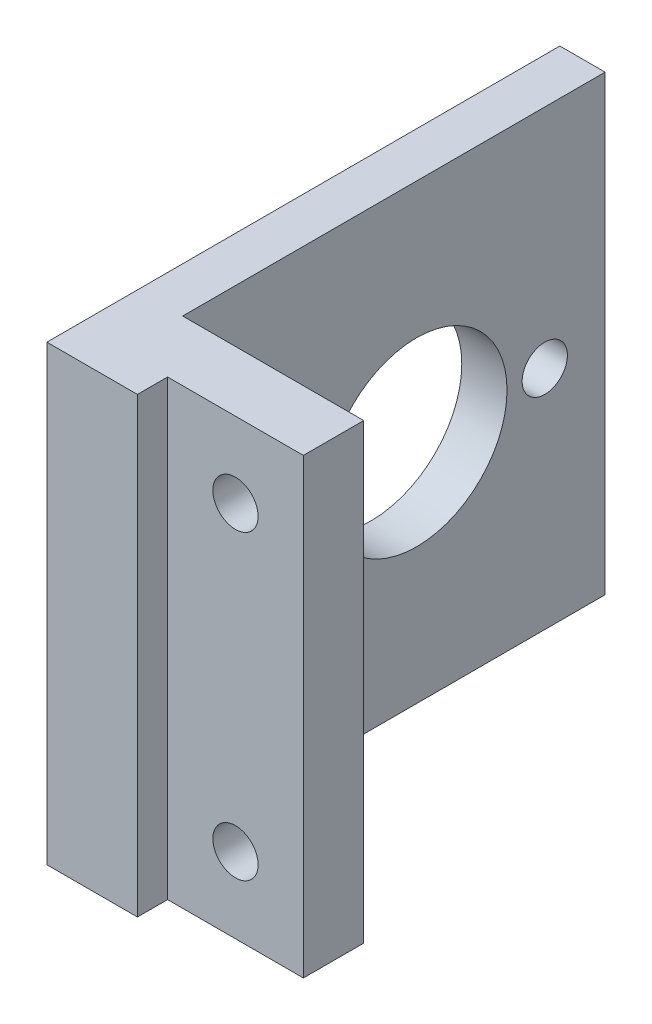
ISO-10303-21;
HEADER;
FILE_DESCRIPTION(('STEP AP214'),'2;1');
FILE_NAME('part.step','',(''),(''),'','','');
FILE_SCHEMA(('AUTOMOTIVE_DESIGN { 1 0 10303 214 1 1 1 1 }'));
ENDSEC;
DATA;
#1=APPLICATION_CONTEXT('core data for automotive mechanical design processes');
#2=APPLICATION_PROTOCOL_DEFINITION('international standard','automotive_design',2000,#1);
#3=PRODUCT_CONTEXT('',#1,'mechanical');
#4=PRODUCT('Part','Part','',(#3));
#5=PRODUCT_RELATED_PRODUCT_CATEGORY('part','',(#4));
#6=PRODUCT_DEFINITION_FORMATION('','',#4);
#7=PRODUCT_DEFINITION_CONTEXT('part definition',#1,'design');
#8=PRODUCT_DEFINITION('design','',#6,#7);
#9=PRODUCT_DEFINITION_SHAPE('','',#8);
#10=(LENGTH_UNIT() NAMED_UNIT(*) SI_UNIT(.MILLI.,.METRE.));
#11=(NAMED_UNIT(*) PLANE_ANGLE_UNIT() SI_UNIT($,.RADIAN.));
#12=(NAMED_UNIT(*) SI_UNIT($,.STERADIAN.) SOLID_ANGLE_UNIT());
#13=UNCERTAINTY_MEASURE_WITH_UNIT(LENGTH_MEASURE(1.E-05),#10,'distance_accuracy_value','');
#14=(GEOMETRIC_REPRESENTATION_CONTEXT(3) GLOBAL_UNCERTAINTY_ASSIGNED_CONTEXT((#13)) GLOBAL_UNIT_ASSIGNED_CONTEXT((#10,
#11,#12)) REPRESENTATION_CONTEXT('',''));
#15=CARTESIAN_POINT('',(0.,0.,0.));
#16=DIRECTION('',(0.,0.,1.));
#17=DIRECTION('',(1.,0.,0.));
#18=AXIS2_PLACEMENT_3D('',#15,#16,#17);
#19=CARTESIAN_POINT('',(0.,30.,0.));
#20=DIRECTION('',(0.,0.,-1.));
#21=DIRECTION('',(-1.,0.,0.));
#22=AXIS2_PLACEMENT_3D('',#19,#20,#21);
#23=PLANE('',#22);
#24=CARTESIAN_POINT('',(10.5,25.,0.));
#25=DIRECTION('',(0.,0.,1.));
#26=DIRECTION('',(1.,0.,0.));
#27=AXIS2_PLACEMENT_3D('',#24,#25,#26);
#28=CIRCLE('',#27,1.5);
#29=CARTESIAN_POINT('',(12.,25.,0.));
#30=VERTEX_POINT('',#29);
#31=EDGE_CURVE('E162',#30,#30,#28,.T.);
#32=ORIENTED_EDGE('',*,*,#31,.F.);
#33=EDGE_LOOP('',(#32));
#34=FACE_BOUND('',#33,.T.);
#35=CARTESIAN_POINT('',(10.5,5.,0.));
#36=DIRECTION('',(0.,0.,1.));
#37=DIRECTION('',(1.,0.,0.));
#38=AXIS2_PLACEMENT_3D('',#35,#36,#37);
#39=CIRCLE('',#38,1.5);
#40=CARTESIAN_POINT('',(12.,5.,0.));
#41=VERTEX_POINT('',#40);
#42=EDGE_CURVE('E170',#41,#41,#39,.T.);
#43=ORIENTED_EDGE('',*,*,#42,.F.);
#44=EDGE_LOOP('',(#43));
#45=FACE_BOUND('',#44,.T.);
#46=DIRECTION('',(0.,1.,0.));
#47=VECTOR('',#46,1.);
#48=CARTESIAN_POINT('',(6.,30.,0.));
#49=LINE('',#48,#47);
#50=CARTESIAN_POINT('',(6.,0.,0.));
#51=VERTEX_POINT('',#50);
#52=CARTESIAN_POINT('',(6.,30.,0.));
#53=VERTEX_POINT('',#52);
#54=EDGE_CURVE('E57',#51,#53,#49,.T.);
#55=ORIENTED_EDGE('',*,*,#54,.F.);
#56=DIRECTION('',(1.,0.,0.));
#57=VECTOR('',#56,1.);
#58=CARTESIAN_POINT('',(0.,0.,0.));
#59=LINE('',#58,#57);
#60=CARTESIAN_POINT('',(15.,0.,0.));
#61=VERTEX_POINT('',#60);
#62=EDGE_CURVE('E139',#51,#61,#59,.T.);
#63=ORIENTED_EDGE('',*,*,#62,.T.);
#64=DIRECTION('',(0.,-1.,0.));
#65=VECTOR('',#64,1.);
#66=CARTESIAN_POINT('',(15.,30.,0.));
#67=LINE('',#66,#65);
#68=CARTESIAN_POINT('',(15.,30.,0.));
#69=VERTEX_POINT('',#68);
#70=EDGE_CURVE('E11',#69,#61,#67,.T.);
#71=ORIENTED_EDGE('',*,*,#70,.F.);
#72=DIRECTION('',(1.,0.,0.));
#73=VECTOR('',#72,1.);
#74=CARTESIAN_POINT('',(0.,30.,0.));
#75=LINE('',#74,#73);
#76=EDGE_CURVE('E96',#53,#69,#75,.T.);
#77=ORIENTED_EDGE('',*,*,#76,.F.);
#78=EDGE_LOOP('',(#55,#63,#71,#77));
#79=FACE_BOUND('',#78,.T.);
#80=ADVANCED_FACE('F39',(#34,#45,#79),#23,.F.);
#81=CARTESIAN_POINT('',(0.,30.,0.));
#82=DIRECTION('',(1.,0.,0.));
#83=DIRECTION('',(0.,0.,-1.));
#84=AXIS2_PLACEMENT_3D('',#81,#82,#83);
#85=PLANE('',#84);
#86=CARTESIAN_POINT('',(0.,15.,-28.));
#87=DIRECTION('',(1.,0.,0.));
#88=DIRECTION('',(0.,0.,-1.));
#89=AXIS2_PLACEMENT_3D('',#86,#87,#88);
#90=CIRCLE('',#89,1.5);
#91=CARTESIAN_POINT('',(0.,15.,-29.5));
#92=VERTEX_POINT('',#91);
#93=EDGE_CURVE('E178',#92,#92,#90,.T.);
#94=ORIENTED_EDGE('',*,*,#93,.T.);
#95=EDGE_LOOP('',(#94));
#96=FACE_BOUND('',#95,.T.);
#97=CARTESIAN_POINT('',(0.,15.,-11.));
#98=DIRECTION('',(1.,0.,0.));
#99=DIRECTION('',(0.,0.,-1.));
#100=AXIS2_PLACEMENT_3D('',#97,#98,#99);
#101=CIRCLE('',#100,1.5);
#102=CARTESIAN_POINT('',(0.,15.,-12.5));
#103=VERTEX_POINT('',#102);
#104=EDGE_CURVE('E186',#103,#103,#101,.T.);
#105=ORIENTED_EDGE('',*,*,#104,.T.);
#106=EDGE_LOOP('',(#105));
#107=FACE_BOUND('',#106,.T.);
#108=CARTESIAN_POINT('',(0.,15.,-19.5));
#109=DIRECTION('',(1.,0.,0.));
#110=DIRECTION('',(0.,0.,-1.));
#111=AXIS2_PLACEMENT_3D('',#108,#109,#110);
#112=CIRCLE('',#111,6.);
#113=CARTESIAN_POINT('',(0.,15.,-25.5));
#114=VERTEX_POINT('',#113);
#115=EDGE_CURVE('E140',#114,#114,#112,.T.);
#116=ORIENTED_EDGE('',*,*,#115,.T.);
#117=EDGE_LOOP('',(#116));
#118=FACE_BOUND('',#117,.T.);
#119=DIRECTION('',(0.,0.,1.));
#120=VECTOR('',#119,1.);
#121=CARTESIAN_POINT('',(0.,0.,0.));
#122=LINE('',#121,#120);
#123=CARTESIAN_POINT('',(0.,0.,-32.));
#124=VERTEX_POINT('',#123);
#125=CARTESIAN_POINT('',(0.,0.,2.));
#126=VERTEX_POINT('',#125);
#127=EDGE_CURVE('E135',#124,#126,#122,.T.);
#128=ORIENTED_EDGE('',*,*,#127,.T.);
#129=DIRECTION('',(0.,-1.,0.));
#130=VECTOR('',#129,1.);
#131=CARTESIAN_POINT('',(0.,30.,2.));
#132=LINE('',#131,#130);
#133=CARTESIAN_POINT('',(0.,30.,2.));
#134=VERTEX_POINT('',#133);
#135=EDGE_CURVE('E193',#134,#126,#132,.T.);
#136=ORIENTED_EDGE('',*,*,#135,.F.);
#137=DIRECTION('',(0.,0.,1.));
#138=VECTOR('',#137,1.);
#139=CARTESIAN_POINT('',(0.,30.,0.));
#140=LINE('',#139,#138);
#141=CARTESIAN_POINT('',(0.,30.,-32.));
#142=VERTEX_POINT('',#141);
#143=EDGE_CURVE('E153',#142,#134,#140,.T.);
#144=ORIENTED_EDGE('',*,*,#143,.F.);
#145=DIRECTION('',(0.,-1.,0.));
#146=VECTOR('',#145,1.);
#147=CARTESIAN_POINT('',(0.,30.,-32.));
#148=LINE('',#147,#146);
#149=EDGE_CURVE('E131',#142,#124,#148,.T.);
#150=ORIENTED_EDGE('',*,*,#149,.T.);
#151=EDGE_LOOP('',(#128,#136,#144,#150));
#152=FACE_BOUND('',#151,.T.);
#153=ADVANCED_FACE('F41',(#96,#107,#118,#152),#85,.F.);
#154=CARTESIAN_POINT('',(15.,30.,0.));
#155=DIRECTION('',(-1.,0.,0.));
#156=DIRECTION('',(0.,0.,1.));
#157=AXIS2_PLACEMENT_3D('',#154,#155,#156);
#158=PLANE('',#157);
#159=DIRECTION('',(0.,0.,-1.));
#160=VECTOR('',#159,1.);
#161=CARTESIAN_POINT('',(15.,0.,0.));
#162=LINE('',#161,#160);
#163=CARTESIAN_POINT('',(15.,0.,-4.));
#164=VERTEX_POINT('',#163);
#165=EDGE_CURVE('E143',#61,#164,#162,.T.);
#166=ORIENTED_EDGE('',*,*,#165,.T.);
#167=DIRECTION('',(0.,-1.,0.));
#168=VECTOR('',#167,1.);
#169=CARTESIAN_POINT('',(15.,30.,-4.));
#170=LINE('',#169,#168);
#171=CARTESIAN_POINT('',(15.,30.,-4.));
#172=VERTEX_POINT('',#171);
#173=EDGE_CURVE('E49',#172,#164,#170,.T.);
#174=ORIENTED_EDGE('',*,*,#173,.F.);
#175=DIRECTION('',(0.,0.,-1.));
#176=VECTOR('',#175,1.);
#177=CARTESIAN_POINT('',(15.,30.,0.));
#178=LINE('',#177,#176);
#179=EDGE_CURVE('E111',#69,#172,#178,.T.);
#180=ORIENTED_EDGE('',*,*,#179,.F.);
#181=ORIENTED_EDGE('',*,*,#70,.T.);
#182=EDGE_LOOP('',(#166,#174,#180,#181));
#183=FACE_BOUND('',#182,.T.);
#184=ADVANCED_FACE('F252',(#183),#158,.F.);
#185=CARTESIAN_POINT('',(15.,30.,-4.));
#186=DIRECTION('',(0.,0.,1.));
#187=DIRECTION('',(1.,0.,0.));
#188=AXIS2_PLACEMENT_3D('',#185,#186,#187);
#189=PLANE('',#188);
#190=CARTESIAN_POINT('',(10.5,25.,-4.));
#191=DIRECTION('',(0.,0.,1.));
#192=DIRECTION('',(1.,0.,0.));
#193=AXIS2_PLACEMENT_3D('',#190,#191,#192);
#194=CIRCLE('',#193,1.5);
#195=CARTESIAN_POINT('',(12.,25.,-4.));
#196=VERTEX_POINT('',#195);
#197=EDGE_CURVE('E43',#196,#196,#194,.T.);
#198=ORIENTED_EDGE('',*,*,#197,.T.);
#199=EDGE_LOOP('',(#198));
#200=FACE_BOUND('',#199,.T.);
#201=CARTESIAN_POINT('',(10.5,5.,-4.));
#202=DIRECTION('',(0.,0.,1.));
#203=DIRECTION('',(1.,0.,0.));
#204=AXIS2_PLACEMENT_3D('',#201,#202,#203);
#205=CIRCLE('',#204,1.5);
#206=CARTESIAN_POINT('',(12.,5.,-4.));
#207=VERTEX_POINT('',#206);
#208=EDGE_CURVE('E159',#207,#207,#205,.T.);
#209=ORIENTED_EDGE('',*,*,#208,.T.);
#210=EDGE_LOOP('',(#209));
#211=FACE_BOUND('',#210,.T.);
#212=DIRECTION('',(-1.,0.,0.));
#213=VECTOR('',#212,1.);
#214=CARTESIAN_POINT('',(15.,0.,-4.));
#215=LINE('',#214,#213);
#216=CARTESIAN_POINT('',(3.,0.,-4.));
#217=VERTEX_POINT('',#216);
#218=EDGE_CURVE('E121',#164,#217,#215,.T.);
#219=ORIENTED_EDGE('',*,*,#218,.T.);
#220=DIRECTION('',(0.,-1.,0.));
#221=VECTOR('',#220,1.);
#222=CARTESIAN_POINT('',(3.,30.,-4.));
#223=LINE('',#222,#221);
#224=CARTESIAN_POINT('',(3.,30.,-4.));
#225=VERTEX_POINT('',#224);
#226=EDGE_CURVE('E118',#225,#217,#223,.T.);
#227=ORIENTED_EDGE('',*,*,#226,.F.);
#228=DIRECTION('',(-1.,0.,0.));
#229=VECTOR('',#228,1.);
#230=CARTESIAN_POINT('',(15.,30.,-4.));
#231=LINE('',#230,#229);
#232=EDGE_CURVE('E104',#172,#225,#231,.T.);
#233=ORIENTED_EDGE('',*,*,#232,.F.);
#234=ORIENTED_EDGE('',*,*,#173,.T.);
#235=EDGE_LOOP('',(#219,#227,#233,#234));
#236=FACE_BOUND('',#235,.T.);
#237=ADVANCED_FACE('F119',(#200,#211,#236),#189,.F.);
#238=CARTESIAN_POINT('',(3.,30.,-32.));
#239=DIRECTION('',(-1.,0.,0.));
#240=DIRECTION('',(0.,0.,1.));
#241=AXIS2_PLACEMENT_3D('',#238,#239,#240);
#242=PLANE('',#241);
#243=CARTESIAN_POINT('',(3.,15.,-28.));
#244=DIRECTION('',(1.,0.,0.));
#245=DIRECTION('',(0.,0.,-1.));
#246=AXIS2_PLACEMENT_3D('',#243,#244,#245);
#247=CIRCLE('',#246,1.5);
#248=CARTESIAN_POINT('',(3.,15.,-29.5));
#249=VERTEX_POINT('',#248);
#250=EDGE_CURVE('E182',#249,#249,#247,.T.);
#251=ORIENTED_EDGE('',*,*,#250,.F.);
#252=EDGE_LOOP('',(#251));
#253=FACE_BOUND('',#252,.T.);
#254=CARTESIAN_POINT('',(3.,15.,-11.));
#255=DIRECTION('',(1.,0.,0.));
#256=DIRECTION('',(0.,0.,-1.));
#257=AXIS2_PLACEMENT_3D('',#254,#255,#256);
#258=CIRCLE('',#257,1.5);
#259=CARTESIAN_POINT('',(3.,15.,-12.5));
#260=VERTEX_POINT('',#259);
#261=EDGE_CURVE('E168',#260,#260,#258,.T.);
#262=ORIENTED_EDGE('',*,*,#261,.F.);
#263=EDGE_LOOP('',(#262));
#264=FACE_BOUND('',#263,.T.);
#265=CARTESIAN_POINT('',(3.,15.,-19.5));
#266=DIRECTION('',(1.,0.,0.));
#267=DIRECTION('',(0.,0.,-1.));
#268=AXIS2_PLACEMENT_3D('',#265,#266,#267);
#269=CIRCLE('',#268,6.);
#270=CARTESIAN_POINT('',(3.,15.,-25.5));
#271=VERTEX_POINT('',#270);
#272=EDGE_CURVE('E218',#271,#271,#269,.T.);
#273=ORIENTED_EDGE('',*,*,#272,.F.);
#274=EDGE_LOOP('',(#273));
#275=FACE_BOUND('',#274,.T.);
#276=DIRECTION('',(0.,0.,-1.));
#277=VECTOR('',#276,1.);
#278=CARTESIAN_POINT('',(3.,0.,-32.));
#279=LINE('',#278,#277);
#280=CARTESIAN_POINT('',(3.,0.,-32.));
#281=VERTEX_POINT('',#280);
#282=EDGE_CURVE('E148',#217,#281,#279,.T.);
#283=ORIENTED_EDGE('',*,*,#282,.T.);
#284=DIRECTION('',(0.,-1.,0.));
#285=VECTOR('',#284,1.);
#286=CARTESIAN_POINT('',(3.,30.,-32.));
#287=LINE('',#286,#285);
#288=CARTESIAN_POINT('',(3.,30.,-32.));
#289=VERTEX_POINT('',#288);
#290=EDGE_CURVE('E125',#289,#281,#287,.T.);
#291=ORIENTED_EDGE('',*,*,#290,.F.);
#292=DIRECTION('',(0.,0.,-1.));
#293=VECTOR('',#292,1.);
#294=CARTESIAN_POINT('',(3.,30.,-32.));
#295=LINE('',#294,#293);
#296=EDGE_CURVE('E108',#225,#289,#295,.T.);
#297=ORIENTED_EDGE('',*,*,#296,.F.);
#298=ORIENTED_EDGE('',*,*,#226,.T.);
#299=EDGE_LOOP('',(#283,#291,#297,#298));
#300=FACE_BOUND('',#299,.T.);
#301=ADVANCED_FACE('F127',(#253,#264,#275,#300),#242,.F.);
#302=CARTESIAN_POINT('',(0.,30.,-32.));
#303=DIRECTION('',(0.,0.,1.));
#304=DIRECTION('',(1.,0.,0.));
#305=AXIS2_PLACEMENT_3D('',#302,#303,#304);
#306=PLANE('',#305);
#307=DIRECTION('',(-1.,0.,0.));
#308=VECTOR('',#307,1.);
#309=CARTESIAN_POINT('',(0.,0.,-32.));
#310=LINE('',#309,#308);
#311=EDGE_CURVE('E89',#281,#124,#310,.T.);
#312=ORIENTED_EDGE('',*,*,#311,.T.);
#313=ORIENTED_EDGE('',*,*,#149,.F.);
#314=DIRECTION('',(-1.,0.,0.));
#315=VECTOR('',#314,1.);
#316=CARTESIAN_POINT('',(0.,30.,-32.));
#317=LINE('',#316,#315);
#318=EDGE_CURVE('E66',#289,#142,#317,.T.);
#319=ORIENTED_EDGE('',*,*,#318,.F.);
#320=ORIENTED_EDGE('',*,*,#290,.T.);
#321=EDGE_LOOP('',(#312,#313,#319,#320));
#322=FACE_BOUND('',#321,.T.);
#323=ADVANCED_FACE('F253',(#322),#306,.F.);
#324=CARTESIAN_POINT('',(0.,30.,0.));
#325=DIRECTION('',(0.,-1.,0.));
#326=DIRECTION('',(0.,0.,-1.));
#327=AXIS2_PLACEMENT_3D('',#324,#325,#326);
#328=PLANE('',#327);
#329=ORIENTED_EDGE('',*,*,#143,.T.);
#330=DIRECTION('',(-1.,0.,0.));
#331=VECTOR('',#330,1.);
#332=CARTESIAN_POINT('',(0.,30.,2.));
#333=LINE('',#332,#331);
#334=CARTESIAN_POINT('',(6.,30.,2.));
#335=VERTEX_POINT('',#334);
#336=EDGE_CURVE('E205',#335,#134,#333,.T.);
#337=ORIENTED_EDGE('',*,*,#336,.F.);
#338=DIRECTION('',(0.,0.,-1.));
#339=VECTOR('',#338,1.);
#340=CARTESIAN_POINT('',(6.,30.,2.));
#341=LINE('',#340,#339);
#342=EDGE_CURVE('E209',#335,#53,#341,.T.);
#343=ORIENTED_EDGE('',*,*,#342,.T.);
#344=ORIENTED_EDGE('',*,*,#76,.T.);
#345=ORIENTED_EDGE('',*,*,#179,.T.);
#346=ORIENTED_EDGE('',*,*,#232,.T.);
#347=ORIENTED_EDGE('',*,*,#296,.T.);
#348=ORIENTED_EDGE('',*,*,#318,.T.);
#349=EDGE_LOOP('',(#329,#337,#343,#344,#345,#346,#347,#348));
#350=FACE_BOUND('',#349,.T.);
#351=ADVANCED_FACE('F106',(#350),#328,.F.);
#352=CARTESIAN_POINT('',(0.,0.,0.));
#353=DIRECTION('',(0.,-1.,0.));
#354=DIRECTION('',(0.,0.,-1.));
#355=AXIS2_PLACEMENT_3D('',#352,#353,#354);
#356=PLANE('',#355);
#357=ORIENTED_EDGE('',*,*,#127,.F.);
#358=ORIENTED_EDGE('',*,*,#311,.F.);
#359=ORIENTED_EDGE('',*,*,#282,.F.);
#360=ORIENTED_EDGE('',*,*,#218,.F.);
#361=ORIENTED_EDGE('',*,*,#165,.F.);
#362=ORIENTED_EDGE('',*,*,#62,.F.);
#363=DIRECTION('',(0.,0.,-1.));
#364=VECTOR('',#363,1.);
#365=CARTESIAN_POINT('',(6.,0.,2.));
#366=LINE('',#365,#364);
#367=CARTESIAN_POINT('',(6.,0.,2.));
#368=VERTEX_POINT('',#367);
#369=EDGE_CURVE('E214',#368,#51,#366,.T.);
#370=ORIENTED_EDGE('',*,*,#369,.F.);
#371=DIRECTION('',(1.,0.,0.));
#372=VECTOR('',#371,1.);
#373=CARTESIAN_POINT('',(0.,0.,2.));
#374=LINE('',#373,#372);
#375=EDGE_CURVE('E197',#126,#368,#374,.T.);
#376=ORIENTED_EDGE('',*,*,#375,.F.);
#377=EDGE_LOOP('',(#357,#358,#359,#360,#361,#362,#370,#376));
#378=FACE_BOUND('',#377,.T.);
#379=ADVANCED_FACE('F245',(#378),#356,.T.);
#380=CARTESIAN_POINT('',(-23.,15.,-19.5));
#381=DIRECTION('',(1.,0.,0.));
#382=DIRECTION('',(0.,0.,-1.));
#383=AXIS2_PLACEMENT_3D('',#380,#381,#382);
#384=CYLINDRICAL_SURFACE('',#383,6.);
#385=CARTESIAN_POINT('',(3.,15.,-25.5));
#386=CARTESIAN_POINT('',(2.96875,15.,-25.5));
#387=CARTESIAN_POINT('',(2.9375,15.,-25.5));
#388=CARTESIAN_POINT('',(2.875,15.,-25.5));
#389=CARTESIAN_POINT('',(2.84375,15.,-25.5));
#390=CARTESIAN_POINT('',(2.78125,15.,-25.5));
#391=CARTESIAN_POINT('',(2.75,15.,-25.5));
#392=CARTESIAN_POINT('',(2.6875,15.,-25.5));
#393=CARTESIAN_POINT('',(2.65625,15.,-25.5));
#394=CARTESIAN_POINT('',(2.59375,15.,-25.5));
#395=CARTESIAN_POINT('',(2.5625,15.,-25.5));
#396=CARTESIAN_POINT('',(2.5,15.,-25.5));
#397=CARTESIAN_POINT('',(2.46875,15.,-25.5));
#398=CARTESIAN_POINT('',(2.40625,15.,-25.5));
#399=CARTESIAN_POINT('',(2.375,15.,-25.5));
#400=CARTESIAN_POINT('',(2.3125,15.,-25.5));
#401=CARTESIAN_POINT('',(2.28125,15.,-25.5));
#402=CARTESIAN_POINT('',(2.21875,15.,-25.5));
#403=CARTESIAN_POINT('',(2.1875,15.,-25.5));
#404=CARTESIAN_POINT('',(2.125,15.,-25.5));
#405=CARTESIAN_POINT('',(2.09375,15.,-25.5));
#406=CARTESIAN_POINT('',(2.03125,15.,-25.5));
#407=CARTESIAN_POINT('',(2.,15.,-25.5));
#408=CARTESIAN_POINT('',(1.9375,15.,-25.5));
#409=CARTESIAN_POINT('',(1.90625,15.,-25.5));
#410=CARTESIAN_POINT('',(1.84375,15.,-25.5));
#411=CARTESIAN_POINT('',(1.8125,15.,-25.5));
#412=CARTESIAN_POINT('',(1.75,15.,-25.5));
#413=CARTESIAN_POINT('',(1.71875,15.,-25.5));
#414=CARTESIAN_POINT('',(1.65625,15.,-25.5));
#415=CARTESIAN_POINT('',(1.625,15.,-25.5));
#416=CARTESIAN_POINT('',(1.5625,15.,-25.5));
#417=CARTESIAN_POINT('',(1.53125,15.,-25.5));
#418=CARTESIAN_POINT('',(1.46875,15.,-25.5));
#419=CARTESIAN_POINT('',(1.4375,15.,-25.5));
#420=CARTESIAN_POINT('',(1.375,15.,-25.5));
#421=CARTESIAN_POINT('',(1.34375,15.,-25.5));
#422=CARTESIAN_POINT('',(1.28125,15.,-25.5));
#423=CARTESIAN_POINT('',(1.25,15.,-25.5));
#424=CARTESIAN_POINT('',(1.1875,15.,-25.5));
#425=CARTESIAN_POINT('',(1.15625,15.,-25.5));
#426=CARTESIAN_POINT('',(1.09375,15.,-25.5));
#427=CARTESIAN_POINT('',(1.0625,15.,-25.5));
#428=CARTESIAN_POINT('',(0.999999999999997,15.,-25.5));
#429=CARTESIAN_POINT('',(0.968749999999997,15.,-25.5));
#430=CARTESIAN_POINT('',(0.906249999999997,15.,-25.5));
#431=CARTESIAN_POINT('',(0.874999999999997,15.,-25.5));
#432=CARTESIAN_POINT('',(0.812499999999998,15.,-25.5));
#433=CARTESIAN_POINT('',(0.78125,15.,-25.5));
#434=CARTESIAN_POINT('',(0.718749999999999,15.,-25.5));
#435=CARTESIAN_POINT('',(0.687499999999998,15.,-25.5));
#436=CARTESIAN_POINT('',(0.624999999999998,15.,-25.5));
#437=CARTESIAN_POINT('',(0.593749999999999,15.,-25.5));
#438=CARTESIAN_POINT('',(0.53125,15.,-25.5));
#439=CARTESIAN_POINT('',(0.5,15.,-25.5));
#440=CARTESIAN_POINT('',(0.4375,15.,-25.5));
#441=CARTESIAN_POINT('',(0.40625,15.,-25.5));
#442=CARTESIAN_POINT('',(0.34375,15.,-25.5));
#443=CARTESIAN_POINT('',(0.3125,15.,-25.5));
#444=CARTESIAN_POINT('',(0.25,15.,-25.5));
#445=CARTESIAN_POINT('',(0.21875,15.,-25.5));
#446=CARTESIAN_POINT('',(0.15625,15.,-25.5));
#447=CARTESIAN_POINT('',(0.125,15.,-25.5));
#448=CARTESIAN_POINT('',(0.0625000000000001,15.,-25.5));
#449=CARTESIAN_POINT('',(0.03125,15.,-25.5));
#450=CARTESIAN_POINT('',(0.,15.,-25.5));
#451=B_SPLINE_CURVE_WITH_KNOTS('',3,(#385,#386,#387,#388,#389,#390,#391,#392,#393,#394,#395,
#396,#397,#398,#399,#400,#401,#402,#403,#404,#405,#406,#407,#408,#409,#410,#411,#412,#413,#414,
#415,#416,#417,#418,#419,#420,#421,#422,#423,#424,#425,#426,#427,#428,#429,#430,#431,#432,#433,
#434,#435,#436,#437,#438,#439,#440,#441,#442,#443,#444,#445,#446,#447,#448,#449,#450),
.UNSPECIFIED.,.F.,.F.,(4,2,2,2,2,2,2,2,2,2,2,2,2,2,2,2,2,2,2,2,2,2,2,2,2,2,2,2,2,2,2,2,4),(0.,
0.0937500000000001,0.1875,0.28125,0.375,0.46875,0.5625,0.656250000000001,0.750000000000001,
0.843749999999997,0.937499999999997,1.03125,1.125,1.21875,1.3125,1.40625,1.5,1.59375,1.6875,
1.78125,1.875,1.96875,2.0625,2.15625,2.25,2.34375,2.4375,2.53125,2.625,2.71875,2.8125,2.90625,
3.),.UNSPECIFIED.);
#452=EDGE_CURVE('BSEAM302',#271,#114,#451,.T.);
#453=ORIENTED_EDGE('',*,*,#272,.T.);
#454=ORIENTED_EDGE('',*,*,#115,.F.);
#455=ORIENTED_EDGE('',*,*,#452,.T.);
#456=ORIENTED_EDGE('',*,*,#452,.F.);
#457=EDGE_LOOP('',(#453,#455,#454,#456));
#458=FACE_BOUND('',#457,.T.);
#459=ADVANCED_FACE('F302',(#458),#384,.F.);
#460=CARTESIAN_POINT('',(6.,30.,2.));
#461=DIRECTION('',(-1.,0.,0.));
#462=DIRECTION('',(0.,-1.,0.));
#463=AXIS2_PLACEMENT_3D('',#460,#461,#462);
#464=PLANE('',#463);
#465=ORIENTED_EDGE('',*,*,#54,.T.);
#466=ORIENTED_EDGE('',*,*,#342,.F.);
#467=DIRECTION('',(0.,1.,0.));
#468=VECTOR('',#467,1.);
#469=CARTESIAN_POINT('',(6.,30.,2.));
#470=LINE('',#469,#468);
#471=EDGE_CURVE('E201',#368,#335,#470,.T.);
#472=ORIENTED_EDGE('',*,*,#471,.F.);
#473=ORIENTED_EDGE('',*,*,#369,.T.);
#474=EDGE_LOOP('',(#465,#466,#472,#473));
#475=FACE_BOUND('',#474,.T.);
#476=ADVANCED_FACE('F250',(#475),#464,.F.);
#477=CARTESIAN_POINT('',(0.,0.,2.));
#478=DIRECTION('',(0.,0.,1.));
#479=DIRECTION('',(1.,0.,0.));
#480=AXIS2_PLACEMENT_3D('',#477,#478,#479);
#481=PLANE('',#480);
#482=ORIENTED_EDGE('',*,*,#135,.T.);
#483=ORIENTED_EDGE('',*,*,#375,.T.);
#484=ORIENTED_EDGE('',*,*,#471,.T.);
#485=ORIENTED_EDGE('',*,*,#336,.T.);
#486=EDGE_LOOP('',(#482,#483,#484,#485));
#487=FACE_BOUND('',#486,.T.);
#488=ADVANCED_FACE('F235',(#487),#481,.T.);
#489=CARTESIAN_POINT('',(0.,15.,-11.));
#490=DIRECTION('',(1.,0.,0.));
#491=DIRECTION('',(0.,0.,-1.));
#492=AXIS2_PLACEMENT_3D('',#489,#490,#491);
#493=CYLINDRICAL_SURFACE('',#492,1.5);
#494=ORIENTED_EDGE('',*,*,#104,.F.);
#495=EDGE_LOOP('',(#494));
#496=FACE_BOUND('',#495,.T.);
#497=ORIENTED_EDGE('',*,*,#261,.T.);
#498=EDGE_LOOP('',(#497));
#499=FACE_BOUND('',#498,.T.);
#500=ADVANCED_FACE('F293',(#496,#499),#493,.F.);
#501=CARTESIAN_POINT('',(0.,15.,-28.));
#502=DIRECTION('',(1.,0.,0.));
#503=DIRECTION('',(0.,0.,-1.));
#504=AXIS2_PLACEMENT_3D('',#501,#502,#503);
#505=CYLINDRICAL_SURFACE('',#504,1.5);
#506=ORIENTED_EDGE('',*,*,#93,.F.);
#507=EDGE_LOOP('',(#506));
#508=FACE_BOUND('',#507,.T.);
#509=ORIENTED_EDGE('',*,*,#250,.T.);
#510=EDGE_LOOP('',(#509));
#511=FACE_BOUND('',#510,.T.);
#512=ADVANCED_FACE('F287',(#508,#511),#505,.F.);
#513=CARTESIAN_POINT('',(10.5,5.,-32.));
#514=DIRECTION('',(0.,0.,1.));
#515=DIRECTION('',(1.,0.,0.));
#516=AXIS2_PLACEMENT_3D('',#513,#514,#515);
#517=CYLINDRICAL_SURFACE('',#516,1.5);
#518=ORIENTED_EDGE('',*,*,#42,.T.);
#519=EDGE_LOOP('',(#518));
#520=FACE_BOUND('',#519,.T.);
#521=ORIENTED_EDGE('',*,*,#208,.F.);
#522=EDGE_LOOP('',(#521));
#523=FACE_BOUND('',#522,.T.);
#524=ADVANCED_FACE('F282',(#520,#523),#517,.F.);
#525=CARTESIAN_POINT('',(10.5,25.,-32.));
#526=DIRECTION('',(0.,0.,1.));
#527=DIRECTION('',(1.,0.,0.));
#528=AXIS2_PLACEMENT_3D('',#525,#526,#527);
#529=CYLINDRICAL_SURFACE('',#528,1.5);
#530=ORIENTED_EDGE('',*,*,#31,.T.);
#531=EDGE_LOOP('',(#530));
#532=FACE_BOUND('',#531,.T.);
#533=ORIENTED_EDGE('',*,*,#197,.F.);
#534=EDGE_LOOP('',(#533));
#535=FACE_BOUND('',#534,.T.);
#536=ADVANCED_FACE('F280',(#532,#535),#529,.F.);
#537=CLOSED_SHELL('',(#80,#153,#184,#237,#301,#323,#351,#379,#459,#476,#488,#500,#512,#524,#536));
#538=MANIFOLD_SOLID_BREP('B2',#537);
#539=ADVANCED_BREP_SHAPE_REPRESENTATION('',(#18,#538),#14);
#540=SHAPE_DEFINITION_REPRESENTATION(#9,#539);
ENDSEC;
END-ISO-10303-21;
